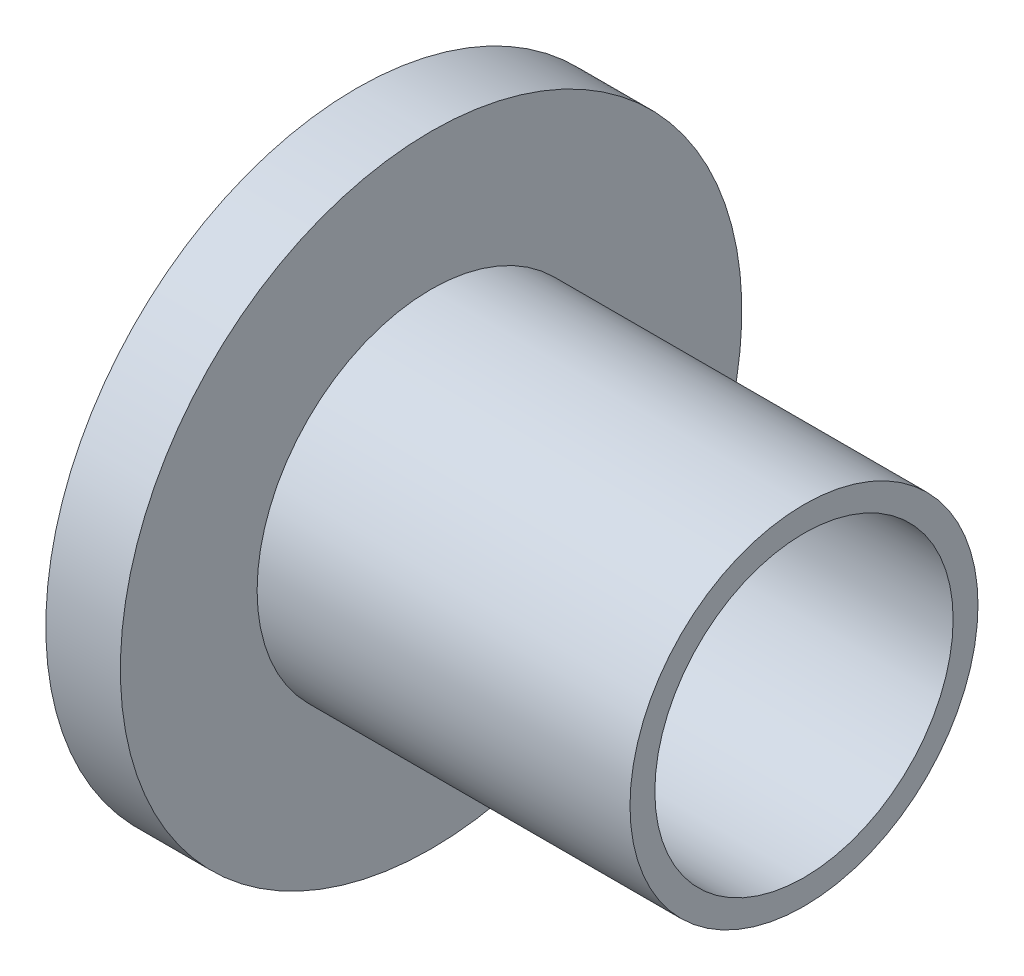
ISO-10303-21;
HEADER;
FILE_DESCRIPTION(('STEP AP214'),'2;1');
FILE_NAME('part.step','',(''),(''),'','','');
FILE_SCHEMA(('AUTOMOTIVE_DESIGN { 1 0 10303 214 1 1 1 1 }'));
ENDSEC;
DATA;
#1=APPLICATION_CONTEXT('core data for automotive mechanical design processes');
#2=APPLICATION_PROTOCOL_DEFINITION('international standard','automotive_design',2000,#1);
#3=PRODUCT_CONTEXT('',#1,'mechanical');
#4=PRODUCT('Part','Part','',(#3));
#5=PRODUCT_RELATED_PRODUCT_CATEGORY('part','',(#4));
#6=PRODUCT_DEFINITION_FORMATION('','',#4);
#7=PRODUCT_DEFINITION_CONTEXT('part definition',#1,'design');
#8=PRODUCT_DEFINITION('design','',#6,#7);
#9=PRODUCT_DEFINITION_SHAPE('','',#8);
#10=(LENGTH_UNIT() NAMED_UNIT(*) SI_UNIT(.MILLI.,.METRE.));
#11=(NAMED_UNIT(*) PLANE_ANGLE_UNIT() SI_UNIT($,.RADIAN.));
#12=(NAMED_UNIT(*) SI_UNIT($,.STERADIAN.) SOLID_ANGLE_UNIT());
#13=UNCERTAINTY_MEASURE_WITH_UNIT(LENGTH_MEASURE(1.E-05),#10,'distance_accuracy_value','');
#14=(GEOMETRIC_REPRESENTATION_CONTEXT(3) GLOBAL_UNCERTAINTY_ASSIGNED_CONTEXT((#13)) GLOBAL_UNIT_ASSIGNED_CONTEXT((#10,
#11,#12)) REPRESENTATION_CONTEXT('',''));
#15=CARTESIAN_POINT('',(0.,0.,0.));
#16=DIRECTION('',(0.,0.,1.));
#17=DIRECTION('',(1.,0.,0.));
#18=AXIS2_PLACEMENT_3D('',#15,#16,#17);
#19=CARTESIAN_POINT('',(-64.9001174574378,0.,0.));
#20=DIRECTION('',(-1.,0.,0.));
#21=DIRECTION('',(0.,-1.,0.));
#22=AXIS2_PLACEMENT_3D('',#19,#20,#21);
#23=CYLINDRICAL_SURFACE('',#22,25.);
#24=CARTESIAN_POINT('',(-5.99999999999999,0.,0.));
#25=DIRECTION('',(-1.,0.,0.));
#26=DIRECTION('',(0.,-1.,0.));
#27=AXIS2_PLACEMENT_3D('',#24,#25,#26);
#28=CIRCLE('',#27,25.);
#29=CARTESIAN_POINT('',(-5.99999999999999,-25.,0.));
#30=VERTEX_POINT('',#29);
#31=EDGE_CURVE('E10',#30,#30,#28,.T.);
#32=ORIENTED_EDGE('',*,*,#31,.F.);
#33=EDGE_LOOP('',(#32));
#34=FACE_BOUND('',#33,.T.);
#35=CARTESIAN_POINT('',(0.,0.,0.));
#36=DIRECTION('',(-1.,0.,0.));
#37=DIRECTION('',(0.,-1.,0.));
#38=AXIS2_PLACEMENT_3D('',#35,#36,#37);
#39=CIRCLE('',#38,25.);
#40=CARTESIAN_POINT('',(0.,-25.,0.));
#41=VERTEX_POINT('',#40);
#42=EDGE_CURVE('E71',#41,#41,#39,.T.);
#43=ORIENTED_EDGE('',*,*,#42,.T.);
#44=EDGE_LOOP('',(#43));
#45=FACE_BOUND('',#44,.T.);
#46=ADVANCED_FACE('F31',(#34,#45),#23,.T.);
#47=CARTESIAN_POINT('',(-6.,25.,0.));
#48=DIRECTION('',(1.,0.,0.));
#49=DIRECTION('',(0.,1.,0.));
#50=AXIS2_PLACEMENT_3D('',#47,#48,#49);
#51=PLANE('',#50);
#52=CARTESIAN_POINT('',(-6.,0.,0.));
#53=DIRECTION('',(-1.,0.,0.));
#54=DIRECTION('',(0.,-1.,0.));
#55=AXIS2_PLACEMENT_3D('',#52,#53,#54);
#56=CIRCLE('',#55,7.50000000000001);
#57=CARTESIAN_POINT('',(-6.,-7.50000000000003,0.));
#58=VERTEX_POINT('',#57);
#59=EDGE_CURVE('E37',#58,#58,#56,.T.);
#60=ORIENTED_EDGE('',*,*,#59,.F.);
#61=EDGE_LOOP('',(#60));
#62=FACE_BOUND('',#61,.T.);
#63=ORIENTED_EDGE('',*,*,#31,.T.);
#64=EDGE_LOOP('',(#63));
#65=FACE_BOUND('',#64,.T.);
#66=ADVANCED_FACE('F132',(#62,#65),#51,.F.);
#67=CARTESIAN_POINT('',(-64.9001174574378,0.,0.));
#68=DIRECTION('',(-1.,0.,0.));
#69=DIRECTION('',(0.,-1.,0.));
#70=AXIS2_PLACEMENT_3D('',#67,#68,#69);
#71=CYLINDRICAL_SURFACE('',#70,7.50000000000001);
#72=CARTESIAN_POINT('',(-16.,0.,0.));
#73=DIRECTION('',(-1.,0.,0.));
#74=DIRECTION('',(0.,-1.,0.));
#75=AXIS2_PLACEMENT_3D('',#72,#73,#74);
#76=CIRCLE('',#75,7.50000000000002);
#77=CARTESIAN_POINT('',(-16.,-7.50000000000003,0.));
#78=VERTEX_POINT('',#77);
#79=EDGE_CURVE('E41',#78,#78,#76,.T.);
#80=ORIENTED_EDGE('',*,*,#79,.F.);
#81=EDGE_LOOP('',(#80));
#82=FACE_BOUND('',#81,.T.);
#83=ORIENTED_EDGE('',*,*,#59,.T.);
#84=EDGE_LOOP('',(#83));
#85=FACE_BOUND('',#84,.T.);
#86=ADVANCED_FACE('F127',(#82,#85),#71,.T.);
#87=CARTESIAN_POINT('',(-16.,6.5,0.));
#88=DIRECTION('',(1.,0.,0.));
#89=DIRECTION('',(0.,1.,0.));
#90=AXIS2_PLACEMENT_3D('',#87,#88,#89);
#91=PLANE('',#90);
#92=CARTESIAN_POINT('',(-16.,0.,0.));
#93=DIRECTION('',(-1.,0.,0.));
#94=DIRECTION('',(0.,-1.,0.));
#95=AXIS2_PLACEMENT_3D('',#92,#93,#94);
#96=CIRCLE('',#95,6.50000000000001);
#97=CARTESIAN_POINT('',(-16.,-6.50000000000003,0.));
#98=VERTEX_POINT('',#97);
#99=EDGE_CURVE('E45',#98,#98,#96,.T.);
#100=ORIENTED_EDGE('',*,*,#99,.F.);
#101=EDGE_LOOP('',(#100));
#102=FACE_BOUND('',#101,.T.);
#103=ORIENTED_EDGE('',*,*,#79,.T.);
#104=EDGE_LOOP('',(#103));
#105=FACE_BOUND('',#104,.T.);
#106=ADVANCED_FACE('F121',(#102,#105),#91,.F.);
#107=CARTESIAN_POINT('',(-64.9001174574378,0.,0.));
#108=DIRECTION('',(-1.,0.,0.));
#109=DIRECTION('',(0.,-1.,0.));
#110=AXIS2_PLACEMENT_3D('',#107,#108,#109);
#111=CYLINDRICAL_SURFACE('',#110,6.50000000000001);
#112=CARTESIAN_POINT('',(-3.,0.,0.));
#113=DIRECTION('',(-1.,0.,0.));
#114=DIRECTION('',(0.,-1.,0.));
#115=AXIS2_PLACEMENT_3D('',#112,#113,#114);
#116=CIRCLE('',#115,6.50000000000001);
#117=CARTESIAN_POINT('',(-2.99999999999999,-6.50000000000002,0.));
#118=VERTEX_POINT('',#117);
#119=EDGE_CURVE('E50',#118,#118,#116,.T.);
#120=ORIENTED_EDGE('',*,*,#119,.F.);
#121=EDGE_LOOP('',(#120));
#122=FACE_BOUND('',#121,.T.);
#123=ORIENTED_EDGE('',*,*,#99,.T.);
#124=EDGE_LOOP('',(#123));
#125=FACE_BOUND('',#124,.T.);
#126=ADVANCED_FACE('F115',(#122,#125),#111,.F.);
#127=CARTESIAN_POINT('',(-3.,10.,0.));
#128=DIRECTION('',(-1.,0.,0.));
#129=DIRECTION('',(0.,-1.,0.));
#130=AXIS2_PLACEMENT_3D('',#127,#128,#129);
#131=PLANE('',#130);
#132=CARTESIAN_POINT('',(-3.,0.,0.));
#133=DIRECTION('',(-1.,0.,0.));
#134=DIRECTION('',(0.,-1.,0.));
#135=AXIS2_PLACEMENT_3D('',#132,#133,#134);
#136=CIRCLE('',#135,10.);
#137=CARTESIAN_POINT('',(-3.,-10.,0.));
#138=VERTEX_POINT('',#137);
#139=EDGE_CURVE('E53',#138,#138,#136,.T.);
#140=ORIENTED_EDGE('',*,*,#139,.F.);
#141=EDGE_LOOP('',(#140));
#142=FACE_BOUND('',#141,.T.);
#143=ORIENTED_EDGE('',*,*,#119,.T.);
#144=EDGE_LOOP('',(#143));
#145=FACE_BOUND('',#144,.T.);
#146=ADVANCED_FACE('F109',(#142,#145),#131,.F.);
#147=CARTESIAN_POINT('',(-64.9001174574378,0.,0.));
#148=DIRECTION('',(-1.,0.,0.));
#149=DIRECTION('',(0.,-1.,0.));
#150=AXIS2_PLACEMENT_3D('',#147,#148,#149);
#151=CYLINDRICAL_SURFACE('',#150,10.);
#152=CARTESIAN_POINT('',(0.,0.,0.));
#153=DIRECTION('',(-1.,0.,0.));
#154=DIRECTION('',(0.,-1.,0.));
#155=AXIS2_PLACEMENT_3D('',#152,#153,#154);
#156=CIRCLE('',#155,10.);
#157=CARTESIAN_POINT('',(0.,-10.,0.));
#158=VERTEX_POINT('',#157);
#159=EDGE_CURVE('E56',#158,#158,#156,.T.);
#160=ORIENTED_EDGE('',*,*,#159,.F.);
#161=EDGE_LOOP('',(#160));
#162=FACE_BOUND('',#161,.T.);
#163=ORIENTED_EDGE('',*,*,#139,.T.);
#164=EDGE_LOOP('',(#163));
#165=FACE_BOUND('',#164,.T.);
#166=ADVANCED_FACE('F103',(#162,#165),#151,.F.);
#167=CARTESIAN_POINT('',(0.,10.,0.));
#168=DIRECTION('',(-1.,0.,0.));
#169=DIRECTION('',(0.,-1.,0.));
#170=AXIS2_PLACEMENT_3D('',#167,#168,#169);
#171=PLANE('',#170);
#172=CARTESIAN_POINT('',(0.,0.,0.));
#173=DIRECTION('',(-1.,0.,0.));
#174=DIRECTION('',(0.,-1.,0.));
#175=AXIS2_PLACEMENT_3D('',#172,#173,#174);
#176=CIRCLE('',#175,12.);
#177=CARTESIAN_POINT('',(0.,-12.,0.));
#178=VERTEX_POINT('',#177);
#179=EDGE_CURVE('E59',#178,#178,#176,.T.);
#180=ORIENTED_EDGE('',*,*,#179,.F.);
#181=EDGE_LOOP('',(#180));
#182=FACE_BOUND('',#181,.T.);
#183=ORIENTED_EDGE('',*,*,#159,.T.);
#184=EDGE_LOOP('',(#183));
#185=FACE_BOUND('',#184,.T.);
#186=ADVANCED_FACE('F97',(#182,#185),#171,.F.);
#187=CARTESIAN_POINT('',(-64.9001174574378,0.,0.));
#188=DIRECTION('',(-1.,0.,0.));
#189=DIRECTION('',(0.,-1.,0.));
#190=AXIS2_PLACEMENT_3D('',#187,#188,#189);
#191=CYLINDRICAL_SURFACE('',#190,12.);
#192=CARTESIAN_POINT('',(30.,0.,0.));
#193=DIRECTION('',(-1.,0.,0.));
#194=DIRECTION('',(0.,-1.,0.));
#195=AXIS2_PLACEMENT_3D('',#192,#193,#194);
#196=CIRCLE('',#195,12.);
#197=CARTESIAN_POINT('',(30.,-12.,0.));
#198=VERTEX_POINT('',#197);
#199=EDGE_CURVE('E62',#198,#198,#196,.T.);
#200=ORIENTED_EDGE('',*,*,#199,.F.);
#201=EDGE_LOOP('',(#200));
#202=FACE_BOUND('',#201,.T.);
#203=ORIENTED_EDGE('',*,*,#179,.T.);
#204=EDGE_LOOP('',(#203));
#205=FACE_BOUND('',#204,.T.);
#206=ADVANCED_FACE('F91',(#202,#205),#191,.F.);
#207=CARTESIAN_POINT('',(30.,12.,0.));
#208=DIRECTION('',(-1.,0.,0.));
#209=DIRECTION('',(0.,-1.,0.));
#210=AXIS2_PLACEMENT_3D('',#207,#208,#209);
#211=PLANE('',#210);
#212=CARTESIAN_POINT('',(30.,0.,0.));
#213=DIRECTION('',(-1.,0.,0.));
#214=DIRECTION('',(0.,-1.,0.));
#215=AXIS2_PLACEMENT_3D('',#212,#213,#214);
#216=CIRCLE('',#215,14.);
#217=CARTESIAN_POINT('',(30.,-14.,0.));
#218=VERTEX_POINT('',#217);
#219=EDGE_CURVE('E65',#218,#218,#216,.T.);
#220=ORIENTED_EDGE('',*,*,#219,.F.);
#221=EDGE_LOOP('',(#220));
#222=FACE_BOUND('',#221,.T.);
#223=ORIENTED_EDGE('',*,*,#199,.T.);
#224=EDGE_LOOP('',(#223));
#225=FACE_BOUND('',#224,.T.);
#226=ADVANCED_FACE('F85',(#222,#225),#211,.F.);
#227=CARTESIAN_POINT('',(-64.9001174574378,0.,0.));
#228=DIRECTION('',(-1.,0.,0.));
#229=DIRECTION('',(0.,-1.,0.));
#230=AXIS2_PLACEMENT_3D('',#227,#228,#229);
#231=CYLINDRICAL_SURFACE('',#230,14.);
#232=CARTESIAN_POINT('',(0.,0.,0.));
#233=DIRECTION('',(-1.,0.,0.));
#234=DIRECTION('',(0.,-1.,0.));
#235=AXIS2_PLACEMENT_3D('',#232,#233,#234);
#236=CIRCLE('',#235,14.);
#237=CARTESIAN_POINT('',(0.,-14.,0.));
#238=VERTEX_POINT('',#237);
#239=EDGE_CURVE('E68',#238,#238,#236,.T.);
#240=ORIENTED_EDGE('',*,*,#239,.F.);
#241=EDGE_LOOP('',(#240));
#242=FACE_BOUND('',#241,.T.);
#243=ORIENTED_EDGE('',*,*,#219,.T.);
#244=EDGE_LOOP('',(#243));
#245=FACE_BOUND('',#244,.T.);
#246=ADVANCED_FACE('F79',(#242,#245),#231,.T.);
#247=CARTESIAN_POINT('',(0.,14.,0.));
#248=DIRECTION('',(-1.,0.,0.));
#249=DIRECTION('',(0.,-1.,0.));
#250=AXIS2_PLACEMENT_3D('',#247,#248,#249);
#251=PLANE('',#250);
#252=ORIENTED_EDGE('',*,*,#42,.F.);
#253=EDGE_LOOP('',(#252));
#254=FACE_BOUND('',#253,.T.);
#255=ORIENTED_EDGE('',*,*,#239,.T.);
#256=EDGE_LOOP('',(#255));
#257=FACE_BOUND('',#256,.T.);
#258=ADVANCED_FACE('F76',(#254,#257),#251,.F.);
#259=CLOSED_SHELL('',(#46,#66,#86,#106,#126,#146,#166,#186,#206,#226,#246,#258));
#260=MANIFOLD_SOLID_BREP('B2',#259);
#261=ADVANCED_BREP_SHAPE_REPRESENTATION('',(#18,#260),#14);
#262=SHAPE_DEFINITION_REPRESENTATION(#9,#261);
ENDSEC;
END-ISO-10303-21;
